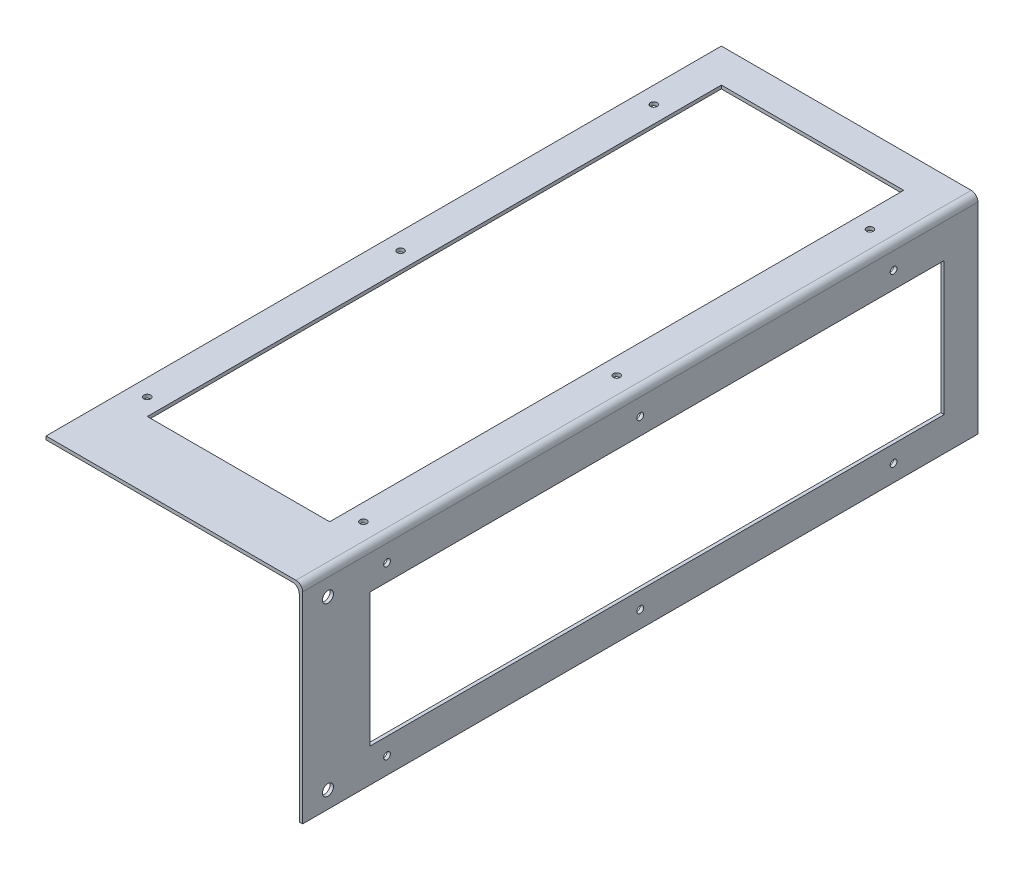
ISO-10303-21;
HEADER;
FILE_DESCRIPTION(('STEP AP214'),'2;1');
FILE_NAME('part.step','',(''),(''),'','','');
FILE_SCHEMA(('AUTOMOTIVE_DESIGN { 1 0 10303 214 1 1 1 1 }'));
ENDSEC;
DATA;
#1=APPLICATION_CONTEXT('core data for automotive mechanical design processes');
#2=APPLICATION_PROTOCOL_DEFINITION('international standard','automotive_design',2000,#1);
#3=PRODUCT_CONTEXT('',#1,'mechanical');
#4=PRODUCT('Part','Part','',(#3));
#5=PRODUCT_RELATED_PRODUCT_CATEGORY('part','',(#4));
#6=PRODUCT_DEFINITION_FORMATION('','',#4);
#7=PRODUCT_DEFINITION_CONTEXT('part definition',#1,'design');
#8=PRODUCT_DEFINITION('design','',#6,#7);
#9=PRODUCT_DEFINITION_SHAPE('','',#8);
#10=(LENGTH_UNIT() NAMED_UNIT(*) SI_UNIT(.MILLI.,.METRE.));
#11=(NAMED_UNIT(*) PLANE_ANGLE_UNIT() SI_UNIT($,.RADIAN.));
#12=(NAMED_UNIT(*) SI_UNIT($,.STERADIAN.) SOLID_ANGLE_UNIT());
#13=UNCERTAINTY_MEASURE_WITH_UNIT(LENGTH_MEASURE(1.E-05),#10,'distance_accuracy_value','');
#14=(GEOMETRIC_REPRESENTATION_CONTEXT(3) GLOBAL_UNCERTAINTY_ASSIGNED_CONTEXT((#13)) GLOBAL_UNIT_ASSIGNED_CONTEXT((#10,
#11,#12)) REPRESENTATION_CONTEXT('',''));
#15=CARTESIAN_POINT('',(0.,0.,0.));
#16=DIRECTION('',(0.,0.,1.));
#17=DIRECTION('',(1.,0.,0.));
#18=AXIS2_PLACEMENT_3D('',#15,#16,#17);
#19=CARTESIAN_POINT('',(148.,0.,400.));
#20=DIRECTION('',(0.,-1.,0.));
#21=DIRECTION('',(1.,0.,0.));
#22=AXIS2_PLACEMENT_3D('',#19,#20,#21);
#23=PLANE('',#22);
#24=CARTESIAN_POINT('',(10.,0.,200.));
#25=DIRECTION('',(0.,1.,0.));
#26=DIRECTION('',(-1.,0.,0.));
#27=AXIS2_PLACEMENT_3D('',#24,#25,#26);
#28=CIRCLE('',#27,2.);
#29=CARTESIAN_POINT('',(8.,0.,200.));
#30=VERTEX_POINT('',#29);
#31=EDGE_CURVE('E325',#30,#30,#28,.T.);
#32=ORIENTED_EDGE('',*,*,#31,.F.);
#33=EDGE_LOOP('',(#32));
#34=FACE_BOUND('',#33,.T.);
#35=CARTESIAN_POINT('',(10.,0.,350.));
#36=DIRECTION('',(0.,1.,0.));
#37=DIRECTION('',(-1.,0.,0.));
#38=AXIS2_PLACEMENT_3D('',#35,#36,#37);
#39=CIRCLE('',#38,2.);
#40=CARTESIAN_POINT('',(8.,0.,350.));
#41=VERTEX_POINT('',#40);
#42=EDGE_CURVE('E329',#41,#41,#39,.T.);
#43=ORIENTED_EDGE('',*,*,#42,.F.);
#44=EDGE_LOOP('',(#43));
#45=FACE_BOUND('',#44,.T.);
#46=CARTESIAN_POINT('',(138.,0.,50.));
#47=DIRECTION('',(0.,1.,0.));
#48=DIRECTION('',(-1.,0.,0.));
#49=AXIS2_PLACEMENT_3D('',#46,#47,#48);
#50=CIRCLE('',#49,2.);
#51=CARTESIAN_POINT('',(136.,0.,50.));
#52=VERTEX_POINT('',#51);
#53=EDGE_CURVE('E333',#52,#52,#50,.T.);
#54=ORIENTED_EDGE('',*,*,#53,.F.);
#55=EDGE_LOOP('',(#54));
#56=FACE_BOUND('',#55,.T.);
#57=CARTESIAN_POINT('',(138.,0.,200.));
#58=DIRECTION('',(0.,1.,0.));
#59=DIRECTION('',(-1.,0.,0.));
#60=AXIS2_PLACEMENT_3D('',#57,#58,#59);
#61=CIRCLE('',#60,2.);
#62=CARTESIAN_POINT('',(136.,0.,200.));
#63=VERTEX_POINT('',#62);
#64=EDGE_CURVE('E337',#63,#63,#61,.T.);
#65=ORIENTED_EDGE('',*,*,#64,.F.);
#66=EDGE_LOOP('',(#65));
#67=FACE_BOUND('',#66,.T.);
#68=CARTESIAN_POINT('',(138.,0.,350.));
#69=DIRECTION('',(0.,1.,0.));
#70=DIRECTION('',(-1.,0.,0.));
#71=AXIS2_PLACEMENT_3D('',#68,#69,#70);
#72=CIRCLE('',#71,2.);
#73=CARTESIAN_POINT('',(136.,0.,350.));
#74=VERTEX_POINT('',#73);
#75=EDGE_CURVE('E341',#74,#74,#72,.T.);
#76=ORIENTED_EDGE('',*,*,#75,.F.);
#77=EDGE_LOOP('',(#76));
#78=FACE_BOUND('',#77,.T.);
#79=CARTESIAN_POINT('',(10.,0.,50.));
#80=DIRECTION('',(0.,1.,0.));
#81=DIRECTION('',(-1.,0.,0.));
#82=AXIS2_PLACEMENT_3D('',#79,#80,#81);
#83=CIRCLE('',#82,2.);
#84=CARTESIAN_POINT('',(8.,0.,50.));
#85=VERTEX_POINT('',#84);
#86=EDGE_CURVE('E345',#85,#85,#83,.T.);
#87=ORIENTED_EDGE('',*,*,#86,.F.);
#88=EDGE_LOOP('',(#87));
#89=FACE_BOUND('',#88,.T.);
#90=DIRECTION('',(-1.,0.,0.));
#91=VECTOR('',#90,1.);
#92=CARTESIAN_POINT('',(20.,0.,20.));
#93=LINE('',#92,#91);
#94=CARTESIAN_POINT('',(128.,0.,20.));
#95=VERTEX_POINT('',#94);
#96=CARTESIAN_POINT('',(20.,0.,20.));
#97=VERTEX_POINT('',#96);
#98=EDGE_CURVE('E174',#95,#97,#93,.T.);
#99=ORIENTED_EDGE('',*,*,#98,.F.);
#100=DIRECTION('',(0.,0.,-1.));
#101=VECTOR('',#100,1.);
#102=CARTESIAN_POINT('',(128.,0.,360.));
#103=LINE('',#102,#101);
#104=CARTESIAN_POINT('',(128.,0.,360.));
#105=VERTEX_POINT('',#104);
#106=EDGE_CURVE('E46',#105,#95,#103,.T.);
#107=ORIENTED_EDGE('',*,*,#106,.F.);
#108=DIRECTION('',(1.,0.,0.));
#109=VECTOR('',#108,1.);
#110=CARTESIAN_POINT('',(20.,0.,360.));
#111=LINE('',#110,#109);
#112=CARTESIAN_POINT('',(20.,0.,360.));
#113=VERTEX_POINT('',#112);
#114=EDGE_CURVE('E162',#113,#105,#111,.T.);
#115=ORIENTED_EDGE('',*,*,#114,.F.);
#116=DIRECTION('',(0.,0.,1.));
#117=VECTOR('',#116,1.);
#118=CARTESIAN_POINT('',(20.,0.,360.));
#119=LINE('',#118,#117);
#120=EDGE_CURVE('E165',#97,#113,#119,.T.);
#121=ORIENTED_EDGE('',*,*,#120,.F.);
#122=EDGE_LOOP('',(#99,#107,#115,#121));
#123=FACE_BOUND('',#122,.T.);
#124=DIRECTION('',(-1.,0.,0.));
#125=VECTOR('',#124,1.);
#126=CARTESIAN_POINT('',(148.,0.,0.));
#127=LINE('',#126,#125);
#128=CARTESIAN_POINT('',(148.,0.,0.));
#129=VERTEX_POINT('',#128);
#130=CARTESIAN_POINT('',(0.,0.,0.));
#131=VERTEX_POINT('',#130);
#132=EDGE_CURVE('E210',#129,#131,#127,.T.);
#133=ORIENTED_EDGE('',*,*,#132,.T.);
#134=DIRECTION('',(0.,0.,-1.));
#135=VECTOR('',#134,1.);
#136=CARTESIAN_POINT('',(0.,0.,400.));
#137=LINE('',#136,#135);
#138=CARTESIAN_POINT('',(0.,0.,400.));
#139=VERTEX_POINT('',#138);
#140=EDGE_CURVE('E11',#139,#131,#137,.T.);
#141=ORIENTED_EDGE('',*,*,#140,.F.);
#142=DIRECTION('',(-1.,0.,0.));
#143=VECTOR('',#142,1.);
#144=CARTESIAN_POINT('',(148.,0.,400.));
#145=LINE('',#144,#143);
#146=CARTESIAN_POINT('',(148.,0.,400.));
#147=VERTEX_POINT('',#146);
#148=EDGE_CURVE('E217',#147,#139,#145,.T.);
#149=ORIENTED_EDGE('',*,*,#148,.F.);
#150=DIRECTION('',(0.,0.,-1.));
#151=VECTOR('',#150,1.);
#152=CARTESIAN_POINT('',(148.,0.,400.));
#153=LINE('',#152,#151);
#154=EDGE_CURVE('E235',#147,#129,#153,.T.);
#155=ORIENTED_EDGE('',*,*,#154,.T.);
#156=EDGE_LOOP('',(#133,#141,#149,#155));
#157=FACE_BOUND('',#156,.T.);
#158=ADVANCED_FACE('F32',(#34,#45,#56,#67,#78,#89,#123,#157),#23,.F.);
#159=CARTESIAN_POINT('',(0.,0.,400.));
#160=DIRECTION('',(1.,0.,0.));
#161=DIRECTION('',(0.,0.,-1.));
#162=AXIS2_PLACEMENT_3D('',#159,#160,#161);
#163=PLANE('',#162);
#164=DIRECTION('',(0.,-1.,0.));
#165=VECTOR('',#164,1.);
#166=CARTESIAN_POINT('',(0.,0.,0.));
#167=LINE('',#166,#165);
#168=CARTESIAN_POINT('',(0.,-2.,0.));
#169=VERTEX_POINT('',#168);
#170=EDGE_CURVE('E238',#131,#169,#167,.T.);
#171=ORIENTED_EDGE('',*,*,#170,.T.);
#172=DIRECTION('',(0.,0.,-1.));
#173=VECTOR('',#172,1.);
#174=CARTESIAN_POINT('',(0.,-2.,400.));
#175=LINE('',#174,#173);
#176=CARTESIAN_POINT('',(0.,-2.,400.));
#177=VERTEX_POINT('',#176);
#178=EDGE_CURVE('E39',#177,#169,#175,.T.);
#179=ORIENTED_EDGE('',*,*,#178,.F.);
#180=DIRECTION('',(0.,-1.,0.));
#181=VECTOR('',#180,1.);
#182=CARTESIAN_POINT('',(0.,0.,400.));
#183=LINE('',#182,#181);
#184=EDGE_CURVE('E220',#139,#177,#183,.T.);
#185=ORIENTED_EDGE('',*,*,#184,.F.);
#186=ORIENTED_EDGE('',*,*,#140,.T.);
#187=EDGE_LOOP('',(#171,#179,#185,#186));
#188=FACE_BOUND('',#187,.T.);
#189=ADVANCED_FACE('F293',(#188),#163,.F.);
#190=CARTESIAN_POINT('',(0.,-2.,400.));
#191=DIRECTION('',(0.,1.,0.));
#192=DIRECTION('',(0.,0.,1.));
#193=AXIS2_PLACEMENT_3D('',#190,#191,#192);
#194=PLANE('',#193);
#195=CARTESIAN_POINT('',(10.,-2.,200.));
#196=DIRECTION('',(0.,1.,0.));
#197=DIRECTION('',(-1.,0.,0.));
#198=AXIS2_PLACEMENT_3D('',#195,#196,#197);
#199=CIRCLE('',#198,2.);
#200=CARTESIAN_POINT('',(8.,-2.,200.));
#201=VERTEX_POINT('',#200);
#202=EDGE_CURVE('E625',#201,#201,#199,.T.);
#203=ORIENTED_EDGE('',*,*,#202,.T.);
#204=EDGE_LOOP('',(#203));
#205=FACE_BOUND('',#204,.T.);
#206=CARTESIAN_POINT('',(10.,-2.,350.));
#207=DIRECTION('',(0.,1.,0.));
#208=DIRECTION('',(-1.,0.,0.));
#209=AXIS2_PLACEMENT_3D('',#206,#207,#208);
#210=CIRCLE('',#209,2.);
#211=CARTESIAN_POINT('',(8.,-2.,350.));
#212=VERTEX_POINT('',#211);
#213=EDGE_CURVE('E629',#212,#212,#210,.T.);
#214=ORIENTED_EDGE('',*,*,#213,.T.);
#215=EDGE_LOOP('',(#214));
#216=FACE_BOUND('',#215,.T.);
#217=CARTESIAN_POINT('',(138.,-1.99999999999999,50.));
#218=DIRECTION('',(0.,1.,0.));
#219=DIRECTION('',(-1.,0.,0.));
#220=AXIS2_PLACEMENT_3D('',#217,#218,#219);
#221=CIRCLE('',#220,2.);
#222=CARTESIAN_POINT('',(136.,-1.99999999999999,50.));
#223=VERTEX_POINT('',#222);
#224=EDGE_CURVE('E633',#223,#223,#221,.T.);
#225=ORIENTED_EDGE('',*,*,#224,.T.);
#226=EDGE_LOOP('',(#225));
#227=FACE_BOUND('',#226,.T.);
#228=CARTESIAN_POINT('',(138.,-1.99999999999999,200.));
#229=DIRECTION('',(0.,1.,0.));
#230=DIRECTION('',(-1.,0.,0.));
#231=AXIS2_PLACEMENT_3D('',#228,#229,#230);
#232=CIRCLE('',#231,2.);
#233=CARTESIAN_POINT('',(136.,-1.99999999999999,200.));
#234=VERTEX_POINT('',#233);
#235=EDGE_CURVE('E637',#234,#234,#232,.T.);
#236=ORIENTED_EDGE('',*,*,#235,.T.);
#237=EDGE_LOOP('',(#236));
#238=FACE_BOUND('',#237,.T.);
#239=CARTESIAN_POINT('',(138.,-1.99999999999999,350.));
#240=DIRECTION('',(0.,1.,0.));
#241=DIRECTION('',(-1.,0.,0.));
#242=AXIS2_PLACEMENT_3D('',#239,#240,#241);
#243=CIRCLE('',#242,2.);
#244=CARTESIAN_POINT('',(136.,-1.99999999999999,350.));
#245=VERTEX_POINT('',#244);
#246=EDGE_CURVE('E621',#245,#245,#243,.T.);
#247=ORIENTED_EDGE('',*,*,#246,.T.);
#248=EDGE_LOOP('',(#247));
#249=FACE_BOUND('',#248,.T.);
#250=CARTESIAN_POINT('',(10.,-2.,50.));
#251=DIRECTION('',(0.,1.,0.));
#252=DIRECTION('',(-1.,0.,0.));
#253=AXIS2_PLACEMENT_3D('',#250,#251,#252);
#254=CIRCLE('',#253,2.);
#255=CARTESIAN_POINT('',(8.,-2.,50.));
#256=VERTEX_POINT('',#255);
#257=EDGE_CURVE('E641',#256,#256,#254,.T.);
#258=ORIENTED_EDGE('',*,*,#257,.T.);
#259=EDGE_LOOP('',(#258));
#260=FACE_BOUND('',#259,.T.);
#261=DIRECTION('',(1.,0.,0.));
#262=VECTOR('',#261,1.);
#263=CARTESIAN_POINT('',(20.,-2.,360.));
#264=LINE('',#263,#262);
#265=CARTESIAN_POINT('',(20.,-2.,360.));
#266=VERTEX_POINT('',#265);
#267=CARTESIAN_POINT('',(128.,-1.99999999999999,360.));
#268=VERTEX_POINT('',#267);
#269=EDGE_CURVE('E152',#266,#268,#264,.T.);
#270=ORIENTED_EDGE('',*,*,#269,.T.);
#271=DIRECTION('',(0.,0.,-1.));
#272=VECTOR('',#271,1.);
#273=CARTESIAN_POINT('',(128.,-1.99999999999999,360.));
#274=LINE('',#273,#272);
#275=CARTESIAN_POINT('',(128.,-1.99999999999999,20.));
#276=VERTEX_POINT('',#275);
#277=EDGE_CURVE('E146',#268,#276,#274,.T.);
#278=ORIENTED_EDGE('',*,*,#277,.T.);
#279=DIRECTION('',(-1.,0.,0.));
#280=VECTOR('',#279,1.);
#281=CARTESIAN_POINT('',(20.,-2.,20.));
#282=LINE('',#281,#280);
#283=CARTESIAN_POINT('',(20.,-2.,20.));
#284=VERTEX_POINT('',#283);
#285=EDGE_CURVE('E155',#276,#284,#282,.T.);
#286=ORIENTED_EDGE('',*,*,#285,.T.);
#287=DIRECTION('',(0.,0.,1.));
#288=VECTOR('',#287,1.);
#289=CARTESIAN_POINT('',(20.,-2.,360.));
#290=LINE('',#289,#288);
#291=EDGE_CURVE('E54',#284,#266,#290,.T.);
#292=ORIENTED_EDGE('',*,*,#291,.T.);
#293=EDGE_LOOP('',(#270,#278,#286,#292));
#294=FACE_BOUND('',#293,.T.);
#295=DIRECTION('',(1.,0.,0.));
#296=VECTOR('',#295,1.);
#297=CARTESIAN_POINT('',(0.,-2.,0.));
#298=LINE('',#297,#296);
#299=CARTESIAN_POINT('',(146.,-2.,0.));
#300=VERTEX_POINT('',#299);
#301=EDGE_CURVE('E240',#169,#300,#298,.T.);
#302=ORIENTED_EDGE('',*,*,#301,.T.);
#303=DIRECTION('',(0.,0.,-1.));
#304=VECTOR('',#303,1.);
#305=CARTESIAN_POINT('',(146.,-2.,400.));
#306=LINE('',#305,#304);
#307=CARTESIAN_POINT('',(146.,-2.,400.));
#308=VERTEX_POINT('',#307);
#309=EDGE_CURVE('E265',#308,#300,#306,.T.);
#310=ORIENTED_EDGE('',*,*,#309,.F.);
#311=DIRECTION('',(1.,0.,0.));
#312=VECTOR('',#311,1.);
#313=CARTESIAN_POINT('',(0.,-2.,400.));
#314=LINE('',#313,#312);
#315=EDGE_CURVE('E223',#177,#308,#314,.T.);
#316=ORIENTED_EDGE('',*,*,#315,.F.);
#317=ORIENTED_EDGE('',*,*,#178,.T.);
#318=EDGE_LOOP('',(#302,#310,#316,#317));
#319=FACE_BOUND('',#318,.T.);
#320=ADVANCED_FACE('F159',(#205,#216,#227,#238,#249,#260,#294,#319),#194,.F.);
#321=CARTESIAN_POINT('',(146.,-6.,400.));
#322=DIRECTION('',(0.,0.,-1.));
#323=DIRECTION('',(-1.,0.,0.));
#324=AXIS2_PLACEMENT_3D('',#321,#322,#323);
#325=CYLINDRICAL_SURFACE('',#324,4.);
#326=CARTESIAN_POINT('',(146.,-6.,0.));
#327=DIRECTION('',(0.,0.,-1.));
#328=DIRECTION('',(1.,0.,0.));
#329=AXIS2_PLACEMENT_3D('',#326,#327,#328);
#330=CIRCLE('',#329,4.);
#331=CARTESIAN_POINT('',(150.,-6.00000000000003,0.));
#332=VERTEX_POINT('',#331);
#333=EDGE_CURVE('E242',#300,#332,#330,.T.);
#334=ORIENTED_EDGE('',*,*,#333,.T.);
#335=DIRECTION('',(0.,0.,-1.));
#336=VECTOR('',#335,1.);
#337=CARTESIAN_POINT('',(150.,-6.00000000000003,400.));
#338=LINE('',#337,#336);
#339=CARTESIAN_POINT('',(150.,-6.00000000000003,400.));
#340=VERTEX_POINT('',#339);
#341=EDGE_CURVE('E262',#340,#332,#338,.T.);
#342=ORIENTED_EDGE('',*,*,#341,.F.);
#343=CARTESIAN_POINT('',(146.,-6.,400.));
#344=DIRECTION('',(0.,0.,-1.));
#345=DIRECTION('',(1.,0.,0.));
#346=AXIS2_PLACEMENT_3D('',#343,#344,#345);
#347=CIRCLE('',#346,4.);
#348=EDGE_CURVE('E225',#308,#340,#347,.T.);
#349=ORIENTED_EDGE('',*,*,#348,.F.);
#350=ORIENTED_EDGE('',*,*,#309,.T.);
#351=EDGE_LOOP('',(#334,#342,#349,#350));
#352=FACE_BOUND('',#351,.T.);
#353=ADVANCED_FACE('F281',(#352),#325,.F.);
#354=CARTESIAN_POINT('',(150.,-6.00000000000003,400.));
#355=DIRECTION('',(1.,0.,0.));
#356=DIRECTION('',(0.,1.,0.));
#357=AXIS2_PLACEMENT_3D('',#354,#355,#356);
#358=PLANE('',#357);
#359=CARTESIAN_POINT('',(150.,-14.0000000000001,50.));
#360=DIRECTION('',(1.,0.,0.));
#361=DIRECTION('',(0.,0.,1.));
#362=AXIS2_PLACEMENT_3D('',#359,#360,#361);
#363=CIRCLE('',#362,2.);
#364=CARTESIAN_POINT('',(150.,-14.0000000000001,52.));
#365=VERTEX_POINT('',#364);
#366=EDGE_CURVE('E605',#365,#365,#363,.T.);
#367=ORIENTED_EDGE('',*,*,#366,.T.);
#368=EDGE_LOOP('',(#367));
#369=FACE_BOUND('',#368,.T.);
#370=CARTESIAN_POINT('',(150.,-13.999999999999,200.));
#371=DIRECTION('',(1.,0.,0.));
#372=DIRECTION('',(0.,0.,1.));
#373=AXIS2_PLACEMENT_3D('',#370,#371,#372);
#374=CIRCLE('',#373,2.00000000000002);
#375=CARTESIAN_POINT('',(150.,-13.999999999999,202.));
#376=VERTEX_POINT('',#375);
#377=EDGE_CURVE('E711',#376,#376,#374,.T.);
#378=ORIENTED_EDGE('',*,*,#377,.T.);
#379=EDGE_LOOP('',(#378));
#380=FACE_BOUND('',#379,.T.);
#381=CARTESIAN_POINT('',(150.,-13.9999999999979,350.));
#382=DIRECTION('',(1.,0.,0.));
#383=DIRECTION('',(0.,0.,1.));
#384=AXIS2_PLACEMENT_3D('',#381,#382,#383);
#385=CIRCLE('',#384,2.);
#386=CARTESIAN_POINT('',(150.,-13.9999999999979,352.));
#387=VERTEX_POINT('',#386);
#388=EDGE_CURVE('E705',#387,#387,#385,.T.);
#389=ORIENTED_EDGE('',*,*,#388,.T.);
#390=EDGE_LOOP('',(#389));
#391=FACE_BOUND('',#390,.T.);
#392=CARTESIAN_POINT('',(150.,-113.000000000002,350.));
#393=DIRECTION('',(1.,0.,0.));
#394=DIRECTION('',(0.,0.,-1.));
#395=AXIS2_PLACEMENT_3D('',#392,#393,#394);
#396=CIRCLE('',#395,2.);
#397=CARTESIAN_POINT('',(150.,-113.000000000002,348.));
#398=VERTEX_POINT('',#397);
#399=EDGE_CURVE('E697',#398,#398,#396,.T.);
#400=ORIENTED_EDGE('',*,*,#399,.T.);
#401=EDGE_LOOP('',(#400));
#402=FACE_BOUND('',#401,.T.);
#403=CARTESIAN_POINT('',(150.,-113.000000000001,200.));
#404=DIRECTION('',(1.,0.,0.));
#405=DIRECTION('',(0.,0.,-1.));
#406=AXIS2_PLACEMENT_3D('',#403,#404,#405);
#407=CIRCLE('',#406,2.00000000000002);
#408=CARTESIAN_POINT('',(150.,-113.000000000001,198.));
#409=VERTEX_POINT('',#408);
#410=EDGE_CURVE('E620',#409,#409,#407,.T.);
#411=ORIENTED_EDGE('',*,*,#410,.T.);
#412=EDGE_LOOP('',(#411));
#413=FACE_BOUND('',#412,.T.);
#414=CARTESIAN_POINT('',(150.,-113.,50.));
#415=DIRECTION('',(1.,0.,0.));
#416=DIRECTION('',(0.,0.,-1.));
#417=AXIS2_PLACEMENT_3D('',#414,#415,#416);
#418=CIRCLE('',#417,2.);
#419=CARTESIAN_POINT('',(150.,-113.,48.));
#420=VERTEX_POINT('',#419);
#421=EDGE_CURVE('E614',#420,#420,#418,.T.);
#422=ORIENTED_EDGE('',*,*,#421,.T.);
#423=EDGE_LOOP('',(#422));
#424=FACE_BOUND('',#423,.T.);
#425=CARTESIAN_POINT('',(150.,-14.,385.));
#426=DIRECTION('',(1.,0.,0.));
#427=DIRECTION('',(0.,0.,-1.));
#428=AXIS2_PLACEMENT_3D('',#425,#426,#427);
#429=CIRCLE('',#428,3.24999999999995);
#430=CARTESIAN_POINT('',(150.,-14.,381.75));
#431=VERTEX_POINT('',#430);
#432=EDGE_CURVE('E175',#431,#431,#429,.T.);
#433=ORIENTED_EDGE('',*,*,#432,.T.);
#434=EDGE_LOOP('',(#433));
#435=FACE_BOUND('',#434,.T.);
#436=CARTESIAN_POINT('',(150.,-113.,385.));
#437=DIRECTION('',(1.,0.,0.));
#438=DIRECTION('',(0.,0.,-1.));
#439=AXIS2_PLACEMENT_3D('',#436,#437,#438);
#440=CIRCLE('',#439,3.24999999999995);
#441=CARTESIAN_POINT('',(150.,-113.,381.75));
#442=VERTEX_POINT('',#441);
#443=EDGE_CURVE('E649',#442,#442,#440,.T.);
#444=ORIENTED_EDGE('',*,*,#443,.T.);
#445=EDGE_LOOP('',(#444));
#446=FACE_BOUND('',#445,.T.);
#447=DIRECTION('',(0.,0.,-1.));
#448=VECTOR('',#447,1.);
#449=CARTESIAN_POINT('',(150.,-103.,360.));
#450=LINE('',#449,#448);
#451=CARTESIAN_POINT('',(150.,-103.,360.));
#452=VERTEX_POINT('',#451);
#453=CARTESIAN_POINT('',(150.,-103.,20.));
#454=VERTEX_POINT('',#453);
#455=EDGE_CURVE('E195',#452,#454,#450,.T.);
#456=ORIENTED_EDGE('',*,*,#455,.T.);
#457=DIRECTION('',(0.,1.,0.));
#458=VECTOR('',#457,1.);
#459=CARTESIAN_POINT('',(150.,-24.,20.));
#460=LINE('',#459,#458);
#461=CARTESIAN_POINT('',(150.,-24.,20.));
#462=VERTEX_POINT('',#461);
#463=EDGE_CURVE('E185',#454,#462,#460,.T.);
#464=ORIENTED_EDGE('',*,*,#463,.T.);
#465=DIRECTION('',(0.,0.,1.));
#466=VECTOR('',#465,1.);
#467=CARTESIAN_POINT('',(150.,-24.,360.));
#468=LINE('',#467,#466);
#469=CARTESIAN_POINT('',(150.,-24.,360.));
#470=VERTEX_POINT('',#469);
#471=EDGE_CURVE('E188',#462,#470,#468,.T.);
#472=ORIENTED_EDGE('',*,*,#471,.T.);
#473=DIRECTION('',(0.,-1.,0.));
#474=VECTOR('',#473,1.);
#475=CARTESIAN_POINT('',(150.,-24.,360.));
#476=LINE('',#475,#474);
#477=EDGE_CURVE('E192',#470,#452,#476,.T.);
#478=ORIENTED_EDGE('',*,*,#477,.T.);
#479=EDGE_LOOP('',(#456,#464,#472,#478));
#480=FACE_BOUND('',#479,.T.);
#481=DIRECTION('',(0.,-1.,0.));
#482=VECTOR('',#481,1.);
#483=CARTESIAN_POINT('',(150.,-6.00000000000003,0.));
#484=LINE('',#483,#482);
#485=CARTESIAN_POINT('',(150.,-123.,0.));
#486=VERTEX_POINT('',#485);
#487=EDGE_CURVE('E244',#332,#486,#484,.T.);
#488=ORIENTED_EDGE('',*,*,#487,.T.);
#489=DIRECTION('',(0.,0.,-1.));
#490=VECTOR('',#489,1.);
#491=CARTESIAN_POINT('',(150.,-123.,400.));
#492=LINE('',#491,#490);
#493=CARTESIAN_POINT('',(150.,-123.,400.));
#494=VERTEX_POINT('',#493);
#495=EDGE_CURVE('E259',#494,#486,#492,.T.);
#496=ORIENTED_EDGE('',*,*,#495,.F.);
#497=DIRECTION('',(0.,-1.,0.));
#498=VECTOR('',#497,1.);
#499=CARTESIAN_POINT('',(150.,-6.00000000000003,400.));
#500=LINE('',#499,#498);
#501=EDGE_CURVE('E227',#340,#494,#500,.T.);
#502=ORIENTED_EDGE('',*,*,#501,.F.);
#503=ORIENTED_EDGE('',*,*,#341,.T.);
#504=EDGE_LOOP('',(#488,#496,#502,#503));
#505=FACE_BOUND('',#504,.T.);
#506=ADVANCED_FACE('F285',(#369,#380,#391,#402,#413,#424,#435,#446,#480,#505),#358,.F.);
#507=CARTESIAN_POINT('',(150.,-123.,400.));
#508=DIRECTION('',(0.,1.,0.));
#509=DIRECTION('',(0.,0.,1.));
#510=AXIS2_PLACEMENT_3D('',#507,#508,#509);
#511=PLANE('',#510);
#512=DIRECTION('',(1.,0.,0.));
#513=VECTOR('',#512,1.);
#514=CARTESIAN_POINT('',(150.,-123.,0.));
#515=LINE('',#514,#513);
#516=CARTESIAN_POINT('',(152.,-123.,0.));
#517=VERTEX_POINT('',#516);
#518=EDGE_CURVE('E246',#486,#517,#515,.T.);
#519=ORIENTED_EDGE('',*,*,#518,.T.);
#520=DIRECTION('',(0.,0.,-1.));
#521=VECTOR('',#520,1.);
#522=CARTESIAN_POINT('',(152.,-123.,400.));
#523=LINE('',#522,#521);
#524=CARTESIAN_POINT('',(152.,-123.,400.));
#525=VERTEX_POINT('',#524);
#526=EDGE_CURVE('E256',#525,#517,#523,.T.);
#527=ORIENTED_EDGE('',*,*,#526,.F.);
#528=DIRECTION('',(1.,0.,0.));
#529=VECTOR('',#528,1.);
#530=CARTESIAN_POINT('',(150.,-123.,400.));
#531=LINE('',#530,#529);
#532=EDGE_CURVE('E229',#494,#525,#531,.T.);
#533=ORIENTED_EDGE('',*,*,#532,.F.);
#534=ORIENTED_EDGE('',*,*,#495,.T.);
#535=EDGE_LOOP('',(#519,#527,#533,#534));
#536=FACE_BOUND('',#535,.T.);
#537=ADVANCED_FACE('F306',(#536),#511,.F.);
#538=CARTESIAN_POINT('',(152.,-123.,400.));
#539=DIRECTION('',(-1.,0.,0.));
#540=DIRECTION('',(0.,0.,1.));
#541=AXIS2_PLACEMENT_3D('',#538,#539,#540);
#542=PLANE('',#541);
#543=CARTESIAN_POINT('',(152.,-14.0000000000001,50.));
#544=DIRECTION('',(1.,0.,0.));
#545=DIRECTION('',(0.,0.,1.));
#546=AXIS2_PLACEMENT_3D('',#543,#544,#545);
#547=CIRCLE('',#546,2.);
#548=CARTESIAN_POINT('',(152.,-14.0000000000001,52.));
#549=VERTEX_POINT('',#548);
#550=EDGE_CURVE('E608',#549,#549,#547,.T.);
#551=ORIENTED_EDGE('',*,*,#550,.F.);
#552=EDGE_LOOP('',(#551));
#553=FACE_BOUND('',#552,.T.);
#554=CARTESIAN_POINT('',(152.,-13.999999999999,200.));
#555=DIRECTION('',(1.,0.,0.));
#556=DIRECTION('',(0.,0.,1.));
#557=AXIS2_PLACEMENT_3D('',#554,#555,#556);
#558=CIRCLE('',#557,2.00000000000002);
#559=CARTESIAN_POINT('',(152.,-13.999999999999,202.));
#560=VERTEX_POINT('',#559);
#561=EDGE_CURVE('E610',#560,#560,#558,.T.);
#562=ORIENTED_EDGE('',*,*,#561,.F.);
#563=EDGE_LOOP('',(#562));
#564=FACE_BOUND('',#563,.T.);
#565=CARTESIAN_POINT('',(152.,-13.9999999999979,350.));
#566=DIRECTION('',(1.,0.,0.));
#567=DIRECTION('',(0.,0.,1.));
#568=AXIS2_PLACEMENT_3D('',#565,#566,#567);
#569=CIRCLE('',#568,2.);
#570=CARTESIAN_POINT('',(152.,-13.9999999999979,352.));
#571=VERTEX_POINT('',#570);
#572=EDGE_CURVE('E708',#571,#571,#569,.T.);
#573=ORIENTED_EDGE('',*,*,#572,.F.);
#574=EDGE_LOOP('',(#573));
#575=FACE_BOUND('',#574,.T.);
#576=CARTESIAN_POINT('',(152.,-113.000000000002,350.));
#577=DIRECTION('',(1.,0.,0.));
#578=DIRECTION('',(0.,0.,-1.));
#579=AXIS2_PLACEMENT_3D('',#576,#577,#578);
#580=CIRCLE('',#579,2.);
#581=CARTESIAN_POINT('',(152.,-113.000000000002,348.));
#582=VERTEX_POINT('',#581);
#583=EDGE_CURVE('E702',#582,#582,#580,.T.);
#584=ORIENTED_EDGE('',*,*,#583,.F.);
#585=EDGE_LOOP('',(#584));
#586=FACE_BOUND('',#585,.T.);
#587=CARTESIAN_POINT('',(152.,-113.000000000001,200.));
#588=DIRECTION('',(1.,0.,0.));
#589=DIRECTION('',(0.,0.,-1.));
#590=AXIS2_PLACEMENT_3D('',#587,#588,#589);
#591=CIRCLE('',#590,2.00000000000002);
#592=CARTESIAN_POINT('',(152.,-113.000000000001,198.));
#593=VERTEX_POINT('',#592);
#594=EDGE_CURVE('E692',#593,#593,#591,.T.);
#595=ORIENTED_EDGE('',*,*,#594,.F.);
#596=EDGE_LOOP('',(#595));
#597=FACE_BOUND('',#596,.T.);
#598=CARTESIAN_POINT('',(152.,-113.,50.));
#599=DIRECTION('',(1.,0.,0.));
#600=DIRECTION('',(0.,0.,-1.));
#601=AXIS2_PLACEMENT_3D('',#598,#599,#600);
#602=CIRCLE('',#601,2.);
#603=CARTESIAN_POINT('',(152.,-113.,48.));
#604=VERTEX_POINT('',#603);
#605=EDGE_CURVE('E617',#604,#604,#602,.T.);
#606=ORIENTED_EDGE('',*,*,#605,.F.);
#607=EDGE_LOOP('',(#606));
#608=FACE_BOUND('',#607,.T.);
#609=CARTESIAN_POINT('',(152.,-14.,385.));
#610=DIRECTION('',(1.,0.,0.));
#611=DIRECTION('',(0.,0.,-1.));
#612=AXIS2_PLACEMENT_3D('',#609,#610,#611);
#613=CIRCLE('',#612,3.24999999999995);
#614=CARTESIAN_POINT('',(152.,-14.,381.75));
#615=VERTEX_POINT('',#614);
#616=EDGE_CURVE('E647',#615,#615,#613,.T.);
#617=ORIENTED_EDGE('',*,*,#616,.F.);
#618=EDGE_LOOP('',(#617));
#619=FACE_BOUND('',#618,.T.);
#620=CARTESIAN_POINT('',(152.,-113.,385.));
#621=DIRECTION('',(1.,0.,0.));
#622=DIRECTION('',(0.,0.,-1.));
#623=AXIS2_PLACEMENT_3D('',#620,#621,#622);
#624=CIRCLE('',#623,3.24999999999995);
#625=CARTESIAN_POINT('',(152.,-113.,381.75));
#626=VERTEX_POINT('',#625);
#627=EDGE_CURVE('E168',#626,#626,#624,.T.);
#628=ORIENTED_EDGE('',*,*,#627,.F.);
#629=EDGE_LOOP('',(#628));
#630=FACE_BOUND('',#629,.T.);
#631=DIRECTION('',(0.,0.,1.));
#632=VECTOR('',#631,1.);
#633=CARTESIAN_POINT('',(152.,-24.,360.));
#634=LINE('',#633,#632);
#635=CARTESIAN_POINT('',(152.,-24.,20.));
#636=VERTEX_POINT('',#635);
#637=CARTESIAN_POINT('',(152.,-24.,360.));
#638=VERTEX_POINT('',#637);
#639=EDGE_CURVE('E200',#636,#638,#634,.T.);
#640=ORIENTED_EDGE('',*,*,#639,.F.);
#641=DIRECTION('',(0.,1.,0.));
#642=VECTOR('',#641,1.);
#643=CARTESIAN_POINT('',(152.,-24.,20.));
#644=LINE('',#643,#642);
#645=CARTESIAN_POINT('',(152.,-103.,20.));
#646=VERTEX_POINT('',#645);
#647=EDGE_CURVE('E181',#646,#636,#644,.T.);
#648=ORIENTED_EDGE('',*,*,#647,.F.);
#649=DIRECTION('',(0.,0.,-1.));
#650=VECTOR('',#649,1.);
#651=CARTESIAN_POINT('',(152.,-103.,360.));
#652=LINE('',#651,#650);
#653=CARTESIAN_POINT('',(152.,-103.,360.));
#654=VERTEX_POINT('',#653);
#655=EDGE_CURVE('E189',#654,#646,#652,.T.);
#656=ORIENTED_EDGE('',*,*,#655,.F.);
#657=DIRECTION('',(0.,-1.,0.));
#658=VECTOR('',#657,1.);
#659=CARTESIAN_POINT('',(152.,-24.,360.));
#660=LINE('',#659,#658);
#661=EDGE_CURVE('E203',#638,#654,#660,.T.);
#662=ORIENTED_EDGE('',*,*,#661,.F.);
#663=EDGE_LOOP('',(#640,#648,#656,#662));
#664=FACE_BOUND('',#663,.T.);
#665=DIRECTION('',(0.,1.,0.));
#666=VECTOR('',#665,1.);
#667=CARTESIAN_POINT('',(152.,-123.,0.));
#668=LINE('',#667,#666);
#669=CARTESIAN_POINT('',(152.,-4.00000000000001,0.));
#670=VERTEX_POINT('',#669);
#671=EDGE_CURVE('E248',#517,#670,#668,.T.);
#672=ORIENTED_EDGE('',*,*,#671,.T.);
#673=DIRECTION('',(0.,0.,-1.));
#674=VECTOR('',#673,1.);
#675=CARTESIAN_POINT('',(152.,-4.00000000000001,400.));
#676=LINE('',#675,#674);
#677=CARTESIAN_POINT('',(152.,-4.00000000000001,400.));
#678=VERTEX_POINT('',#677);
#679=EDGE_CURVE('E253',#678,#670,#676,.T.);
#680=ORIENTED_EDGE('',*,*,#679,.F.);
#681=DIRECTION('',(0.,1.,0.));
#682=VECTOR('',#681,1.);
#683=CARTESIAN_POINT('',(152.,-123.,400.));
#684=LINE('',#683,#682);
#685=EDGE_CURVE('E231',#525,#678,#684,.T.);
#686=ORIENTED_EDGE('',*,*,#685,.F.);
#687=ORIENTED_EDGE('',*,*,#526,.T.);
#688=EDGE_LOOP('',(#672,#680,#686,#687));
#689=FACE_BOUND('',#688,.T.);
#690=ADVANCED_FACE('F304',(#553,#564,#575,#586,#597,#608,#619,#630,#664,#689),#542,.F.);
#691=CARTESIAN_POINT('',(148.,-3.99999999999998,400.));
#692=DIRECTION('',(0.,0.,-1.));
#693=DIRECTION('',(-1.,0.,0.));
#694=AXIS2_PLACEMENT_3D('',#691,#692,#693);
#695=CYLINDRICAL_SURFACE('',#694,4.);
#696=CARTESIAN_POINT('',(148.,-3.99999999999998,0.));
#697=DIRECTION('',(0.,0.,1.));
#698=DIRECTION('',(1.,0.,0.));
#699=AXIS2_PLACEMENT_3D('',#696,#697,#698);
#700=CIRCLE('',#699,4.);
#701=EDGE_CURVE('E221',#670,#129,#700,.T.);
#702=ORIENTED_EDGE('',*,*,#701,.T.);
#703=ORIENTED_EDGE('',*,*,#154,.F.);
#704=CARTESIAN_POINT('',(148.,-3.99999999999998,400.));
#705=DIRECTION('',(0.,0.,1.));
#706=DIRECTION('',(1.,0.,0.));
#707=AXIS2_PLACEMENT_3D('',#704,#705,#706);
#708=CIRCLE('',#707,4.);
#709=EDGE_CURVE('E233',#678,#147,#708,.T.);
#710=ORIENTED_EDGE('',*,*,#709,.F.);
#711=ORIENTED_EDGE('',*,*,#679,.T.);
#712=EDGE_LOOP('',(#702,#703,#710,#711));
#713=FACE_BOUND('',#712,.T.);
#714=ADVANCED_FACE('F299',(#713),#695,.T.);
#715=CARTESIAN_POINT('',(146.,-6.,400.));
#716=DIRECTION('',(0.,0.,1.));
#717=DIRECTION('',(1.,0.,0.));
#718=AXIS2_PLACEMENT_3D('',#715,#716,#717);
#719=PLANE('',#718);
#720=ORIENTED_EDGE('',*,*,#148,.T.);
#721=ORIENTED_EDGE('',*,*,#184,.T.);
#722=ORIENTED_EDGE('',*,*,#315,.T.);
#723=ORIENTED_EDGE('',*,*,#348,.T.);
#724=ORIENTED_EDGE('',*,*,#501,.T.);
#725=ORIENTED_EDGE('',*,*,#532,.T.);
#726=ORIENTED_EDGE('',*,*,#685,.T.);
#727=ORIENTED_EDGE('',*,*,#709,.T.);
#728=EDGE_LOOP('',(#720,#721,#722,#723,#724,#725,#726,#727));
#729=FACE_BOUND('',#728,.T.);
#730=ADVANCED_FACE('F289',(#729),#719,.T.);
#731=CARTESIAN_POINT('',(146.,-6.,0.));
#732=DIRECTION('',(0.,0.,1.));
#733=DIRECTION('',(1.,0.,0.));
#734=AXIS2_PLACEMENT_3D('',#731,#732,#733);
#735=PLANE('',#734);
#736=ORIENTED_EDGE('',*,*,#132,.F.);
#737=ORIENTED_EDGE('',*,*,#701,.F.);
#738=ORIENTED_EDGE('',*,*,#671,.F.);
#739=ORIENTED_EDGE('',*,*,#518,.F.);
#740=ORIENTED_EDGE('',*,*,#487,.F.);
#741=ORIENTED_EDGE('',*,*,#333,.F.);
#742=ORIENTED_EDGE('',*,*,#301,.F.);
#743=ORIENTED_EDGE('',*,*,#170,.F.);
#744=EDGE_LOOP('',(#736,#737,#738,#739,#740,#741,#742,#743));
#745=FACE_BOUND('',#744,.T.);
#746=ADVANCED_FACE('F276',(#745),#735,.F.);
#747=CARTESIAN_POINT('',(150.,-24.,20.));
#748=DIRECTION('',(0.,0.,-1.));
#749=DIRECTION('',(-1.,0.,0.));
#750=AXIS2_PLACEMENT_3D('',#747,#748,#749);
#751=PLANE('',#750);
#752=ORIENTED_EDGE('',*,*,#647,.T.);
#753=DIRECTION('',(1.,0.,0.));
#754=VECTOR('',#753,1.);
#755=CARTESIAN_POINT('',(150.,-24.,20.));
#756=LINE('',#755,#754);
#757=EDGE_CURVE('E198',#462,#636,#756,.T.);
#758=ORIENTED_EDGE('',*,*,#757,.F.);
#759=ORIENTED_EDGE('',*,*,#463,.F.);
#760=DIRECTION('',(1.,0.,0.));
#761=VECTOR('',#760,1.);
#762=CARTESIAN_POINT('',(150.,-103.,20.));
#763=LINE('',#762,#761);
#764=EDGE_CURVE('E208',#454,#646,#763,.T.);
#765=ORIENTED_EDGE('',*,*,#764,.T.);
#766=EDGE_LOOP('',(#752,#758,#759,#765));
#767=FACE_BOUND('',#766,.T.);
#768=ADVANCED_FACE('F370',(#767),#751,.F.);
#769=CARTESIAN_POINT('',(150.,-103.,360.));
#770=DIRECTION('',(0.,-1.,0.));
#771=DIRECTION('',(0.,0.,-1.));
#772=AXIS2_PLACEMENT_3D('',#769,#770,#771);
#773=PLANE('',#772);
#774=ORIENTED_EDGE('',*,*,#655,.T.);
#775=ORIENTED_EDGE('',*,*,#764,.F.);
#776=ORIENTED_EDGE('',*,*,#455,.F.);
#777=DIRECTION('',(1.,0.,0.));
#778=VECTOR('',#777,1.);
#779=CARTESIAN_POINT('',(150.,-103.,360.));
#780=LINE('',#779,#778);
#781=EDGE_CURVE('E211',#452,#654,#780,.T.);
#782=ORIENTED_EDGE('',*,*,#781,.T.);
#783=EDGE_LOOP('',(#774,#775,#776,#782));
#784=FACE_BOUND('',#783,.T.);
#785=ADVANCED_FACE('F366',(#784),#773,.F.);
#786=CARTESIAN_POINT('',(150.,-24.,360.));
#787=DIRECTION('',(0.,0.,1.));
#788=DIRECTION('',(1.,0.,0.));
#789=AXIS2_PLACEMENT_3D('',#786,#787,#788);
#790=PLANE('',#789);
#791=ORIENTED_EDGE('',*,*,#661,.T.);
#792=ORIENTED_EDGE('',*,*,#781,.F.);
#793=ORIENTED_EDGE('',*,*,#477,.F.);
#794=DIRECTION('',(1.,0.,0.));
#795=VECTOR('',#794,1.);
#796=CARTESIAN_POINT('',(150.,-24.,360.));
#797=LINE('',#796,#795);
#798=EDGE_CURVE('E213',#470,#638,#797,.T.);
#799=ORIENTED_EDGE('',*,*,#798,.T.);
#800=EDGE_LOOP('',(#791,#792,#793,#799));
#801=FACE_BOUND('',#800,.T.);
#802=ADVANCED_FACE('F369',(#801),#790,.F.);
#803=CARTESIAN_POINT('',(150.,-24.,360.));
#804=DIRECTION('',(0.,1.,0.));
#805=DIRECTION('',(0.,0.,1.));
#806=AXIS2_PLACEMENT_3D('',#803,#804,#805);
#807=PLANE('',#806);
#808=ORIENTED_EDGE('',*,*,#639,.T.);
#809=ORIENTED_EDGE('',*,*,#798,.F.);
#810=ORIENTED_EDGE('',*,*,#471,.F.);
#811=ORIENTED_EDGE('',*,*,#757,.T.);
#812=EDGE_LOOP('',(#808,#809,#810,#811));
#813=FACE_BOUND('',#812,.T.);
#814=ADVANCED_FACE('F358',(#813),#807,.F.);
#815=CARTESIAN_POINT('',(128.,-1.99999999999999,360.));
#816=DIRECTION('',(1.,0.,0.));
#817=DIRECTION('',(0.,1.,0.));
#818=AXIS2_PLACEMENT_3D('',#815,#816,#817);
#819=PLANE('',#818);
#820=ORIENTED_EDGE('',*,*,#106,.T.);
#821=DIRECTION('',(0.,1.,0.));
#822=VECTOR('',#821,1.);
#823=CARTESIAN_POINT('',(128.,-1.99999999999999,20.));
#824=LINE('',#823,#822);
#825=EDGE_CURVE('E142',#276,#95,#824,.T.);
#826=ORIENTED_EDGE('',*,*,#825,.F.);
#827=ORIENTED_EDGE('',*,*,#277,.F.);
#828=DIRECTION('',(0.,1.,0.));
#829=VECTOR('',#828,1.);
#830=CARTESIAN_POINT('',(128.,-1.99999999999999,360.));
#831=LINE('',#830,#829);
#832=EDGE_CURVE('E179',#268,#105,#831,.T.);
#833=ORIENTED_EDGE('',*,*,#832,.T.);
#834=EDGE_LOOP('',(#820,#826,#827,#833));
#835=FACE_BOUND('',#834,.T.);
#836=ADVANCED_FACE('F144',(#835),#819,.F.);
#837=CARTESIAN_POINT('',(20.,-2.,360.));
#838=DIRECTION('',(0.,0.,1.));
#839=DIRECTION('',(1.,0.,0.));
#840=AXIS2_PLACEMENT_3D('',#837,#838,#839);
#841=PLANE('',#840);
#842=ORIENTED_EDGE('',*,*,#114,.T.);
#843=ORIENTED_EDGE('',*,*,#832,.F.);
#844=ORIENTED_EDGE('',*,*,#269,.F.);
#845=DIRECTION('',(0.,1.,0.));
#846=VECTOR('',#845,1.);
#847=CARTESIAN_POINT('',(20.,-2.,360.));
#848=LINE('',#847,#846);
#849=EDGE_CURVE('E182',#266,#113,#848,.T.);
#850=ORIENTED_EDGE('',*,*,#849,.T.);
#851=EDGE_LOOP('',(#842,#843,#844,#850));
#852=FACE_BOUND('',#851,.T.);
#853=ADVANCED_FACE('F350',(#852),#841,.F.);
#854=CARTESIAN_POINT('',(20.,-2.,360.));
#855=DIRECTION('',(-1.,0.,0.));
#856=DIRECTION('',(0.,-1.,0.));
#857=AXIS2_PLACEMENT_3D('',#854,#855,#856);
#858=PLANE('',#857);
#859=ORIENTED_EDGE('',*,*,#120,.T.);
#860=ORIENTED_EDGE('',*,*,#849,.F.);
#861=ORIENTED_EDGE('',*,*,#291,.F.);
#862=DIRECTION('',(0.,1.,0.));
#863=VECTOR('',#862,1.);
#864=CARTESIAN_POINT('',(20.,-2.,20.));
#865=LINE('',#864,#863);
#866=EDGE_CURVE('E151',#284,#97,#865,.T.);
#867=ORIENTED_EDGE('',*,*,#866,.T.);
#868=EDGE_LOOP('',(#859,#860,#861,#867));
#869=FACE_BOUND('',#868,.T.);
#870=ADVANCED_FACE('F348',(#869),#858,.F.);
#871=CARTESIAN_POINT('',(20.,-2.,20.));
#872=DIRECTION('',(0.,0.,-1.));
#873=DIRECTION('',(-1.,0.,0.));
#874=AXIS2_PLACEMENT_3D('',#871,#872,#873);
#875=PLANE('',#874);
#876=ORIENTED_EDGE('',*,*,#98,.T.);
#877=ORIENTED_EDGE('',*,*,#866,.F.);
#878=ORIENTED_EDGE('',*,*,#285,.F.);
#879=ORIENTED_EDGE('',*,*,#825,.T.);
#880=EDGE_LOOP('',(#876,#877,#878,#879));
#881=FACE_BOUND('',#880,.T.);
#882=ADVANCED_FACE('F156',(#881),#875,.F.);
#883=CARTESIAN_POINT('',(150.,-113.,385.));
#884=DIRECTION('',(1.,0.,0.));
#885=DIRECTION('',(0.,0.,-1.));
#886=AXIS2_PLACEMENT_3D('',#883,#884,#885);
#887=CYLINDRICAL_SURFACE('',#886,3.24999999999995);
#888=ORIENTED_EDGE('',*,*,#443,.F.);
#889=EDGE_LOOP('',(#888));
#890=FACE_BOUND('',#889,.T.);
#891=ORIENTED_EDGE('',*,*,#627,.T.);
#892=EDGE_LOOP('',(#891));
#893=FACE_BOUND('',#892,.T.);
#894=ADVANCED_FACE('F361',(#890,#893),#887,.F.);
#895=CARTESIAN_POINT('',(150.,-14.,385.));
#896=DIRECTION('',(1.,0.,0.));
#897=DIRECTION('',(0.,0.,-1.));
#898=AXIS2_PLACEMENT_3D('',#895,#896,#897);
#899=CYLINDRICAL_SURFACE('',#898,3.24999999999995);
#900=ORIENTED_EDGE('',*,*,#432,.F.);
#901=EDGE_LOOP('',(#900));
#902=FACE_BOUND('',#901,.T.);
#903=ORIENTED_EDGE('',*,*,#616,.T.);
#904=EDGE_LOOP('',(#903));
#905=FACE_BOUND('',#904,.T.);
#906=ADVANCED_FACE('F443',(#902,#905),#899,.F.);
#907=CARTESIAN_POINT('',(10.,-2.,50.));
#908=DIRECTION('',(0.,1.,0.));
#909=DIRECTION('',(-1.,0.,0.));
#910=AXIS2_PLACEMENT_3D('',#907,#908,#909);
#911=CYLINDRICAL_SURFACE('',#910,2.);
#912=ORIENTED_EDGE('',*,*,#257,.F.);
#913=EDGE_LOOP('',(#912));
#914=FACE_BOUND('',#913,.T.);
#915=ORIENTED_EDGE('',*,*,#86,.T.);
#916=EDGE_LOOP('',(#915));
#917=FACE_BOUND('',#916,.T.);
#918=ADVANCED_FACE('F451',(#914,#917),#911,.F.);
#919=CARTESIAN_POINT('',(138.,-1.99999999999999,350.));
#920=DIRECTION('',(0.,1.,0.));
#921=DIRECTION('',(-1.,0.,0.));
#922=AXIS2_PLACEMENT_3D('',#919,#920,#921);
#923=CYLINDRICAL_SURFACE('',#922,2.);
#924=ORIENTED_EDGE('',*,*,#246,.F.);
#925=EDGE_LOOP('',(#924));
#926=FACE_BOUND('',#925,.T.);
#927=ORIENTED_EDGE('',*,*,#75,.T.);
#928=EDGE_LOOP('',(#927));
#929=FACE_BOUND('',#928,.T.);
#930=ADVANCED_FACE('F477',(#926,#929),#923,.F.);
#931=CARTESIAN_POINT('',(138.,-1.99999999999999,200.));
#932=DIRECTION('',(0.,1.,0.));
#933=DIRECTION('',(-1.,0.,0.));
#934=AXIS2_PLACEMENT_3D('',#931,#932,#933);
#935=CYLINDRICAL_SURFACE('',#934,2.);
#936=ORIENTED_EDGE('',*,*,#235,.F.);
#937=EDGE_LOOP('',(#936));
#938=FACE_BOUND('',#937,.T.);
#939=ORIENTED_EDGE('',*,*,#64,.T.);
#940=EDGE_LOOP('',(#939));
#941=FACE_BOUND('',#940,.T.);
#942=ADVANCED_FACE('F487',(#938,#941),#935,.F.);
#943=CARTESIAN_POINT('',(138.,-1.99999999999999,50.));
#944=DIRECTION('',(0.,1.,0.));
#945=DIRECTION('',(-1.,0.,0.));
#946=AXIS2_PLACEMENT_3D('',#943,#944,#945);
#947=CYLINDRICAL_SURFACE('',#946,2.);
#948=ORIENTED_EDGE('',*,*,#224,.F.);
#949=EDGE_LOOP('',(#948));
#950=FACE_BOUND('',#949,.T.);
#951=ORIENTED_EDGE('',*,*,#53,.T.);
#952=EDGE_LOOP('',(#951));
#953=FACE_BOUND('',#952,.T.);
#954=ADVANCED_FACE('F497',(#950,#953),#947,.F.);
#955=CARTESIAN_POINT('',(10.,-2.,350.));
#956=DIRECTION('',(0.,1.,0.));
#957=DIRECTION('',(-1.,0.,0.));
#958=AXIS2_PLACEMENT_3D('',#955,#956,#957);
#959=CYLINDRICAL_SURFACE('',#958,2.);
#960=ORIENTED_EDGE('',*,*,#213,.F.);
#961=EDGE_LOOP('',(#960));
#962=FACE_BOUND('',#961,.T.);
#963=ORIENTED_EDGE('',*,*,#42,.T.);
#964=EDGE_LOOP('',(#963));
#965=FACE_BOUND('',#964,.T.);
#966=ADVANCED_FACE('F507',(#962,#965),#959,.F.);
#967=CARTESIAN_POINT('',(10.,-2.,200.));
#968=DIRECTION('',(0.,1.,0.));
#969=DIRECTION('',(-1.,0.,0.));
#970=AXIS2_PLACEMENT_3D('',#967,#968,#969);
#971=CYLINDRICAL_SURFACE('',#970,2.);
#972=ORIENTED_EDGE('',*,*,#202,.F.);
#973=EDGE_LOOP('',(#972));
#974=FACE_BOUND('',#973,.T.);
#975=ORIENTED_EDGE('',*,*,#31,.T.);
#976=EDGE_LOOP('',(#975));
#977=FACE_BOUND('',#976,.T.);
#978=ADVANCED_FACE('F517',(#974,#977),#971,.F.);
#979=CARTESIAN_POINT('',(150.,-113.,50.));
#980=DIRECTION('',(1.,0.,0.));
#981=DIRECTION('',(0.,0.,-1.));
#982=AXIS2_PLACEMENT_3D('',#979,#980,#981);
#983=CYLINDRICAL_SURFACE('',#982,2.);
#984=ORIENTED_EDGE('',*,*,#421,.F.);
#985=EDGE_LOOP('',(#984));
#986=FACE_BOUND('',#985,.T.);
#987=ORIENTED_EDGE('',*,*,#605,.T.);
#988=EDGE_LOOP('',(#987));
#989=FACE_BOUND('',#988,.T.);
#990=ADVANCED_FACE('F527',(#986,#989),#983,.F.);
#991=CARTESIAN_POINT('',(150.,-113.000000000001,200.));
#992=DIRECTION('',(1.,0.,0.));
#993=DIRECTION('',(0.,0.,-1.));
#994=AXIS2_PLACEMENT_3D('',#991,#992,#993);
#995=CYLINDRICAL_SURFACE('',#994,2.00000000000002);
#996=ORIENTED_EDGE('',*,*,#410,.F.);
#997=EDGE_LOOP('',(#996));
#998=FACE_BOUND('',#997,.T.);
#999=ORIENTED_EDGE('',*,*,#594,.T.);
#1000=EDGE_LOOP('',(#999));
#1001=FACE_BOUND('',#1000,.T.);
#1002=ADVANCED_FACE('F548',(#998,#1001),#995,.F.);
#1003=CARTESIAN_POINT('',(150.,-113.000000000002,350.));
#1004=DIRECTION('',(1.,0.,0.));
#1005=DIRECTION('',(0.,0.,-1.));
#1006=AXIS2_PLACEMENT_3D('',#1003,#1004,#1005);
#1007=CYLINDRICAL_SURFACE('',#1006,2.);
#1008=ORIENTED_EDGE('',*,*,#399,.F.);
#1009=EDGE_LOOP('',(#1008));
#1010=FACE_BOUND('',#1009,.T.);
#1011=ORIENTED_EDGE('',*,*,#583,.T.);
#1012=EDGE_LOOP('',(#1011));
#1013=FACE_BOUND('',#1012,.T.);
#1014=ADVANCED_FACE('F558',(#1010,#1013),#1007,.F.);
#1015=CARTESIAN_POINT('',(150.,-13.9999999999979,350.));
#1016=DIRECTION('',(1.,0.,0.));
#1017=DIRECTION('',(0.,0.,-1.));
#1018=AXIS2_PLACEMENT_3D('',#1015,#1016,#1017);
#1019=CYLINDRICAL_SURFACE('',#1018,2.);
#1020=ORIENTED_EDGE('',*,*,#388,.F.);
#1021=EDGE_LOOP('',(#1020));
#1022=FACE_BOUND('',#1021,.T.);
#1023=ORIENTED_EDGE('',*,*,#572,.T.);
#1024=EDGE_LOOP('',(#1023));
#1025=FACE_BOUND('',#1024,.T.);
#1026=ADVANCED_FACE('F568',(#1022,#1025),#1019,.F.);
#1027=CARTESIAN_POINT('',(150.,-13.999999999999,200.));
#1028=DIRECTION('',(1.,0.,0.));
#1029=DIRECTION('',(0.,0.,-1.));
#1030=AXIS2_PLACEMENT_3D('',#1027,#1028,#1029);
#1031=CYLINDRICAL_SURFACE('',#1030,2.00000000000002);
#1032=ORIENTED_EDGE('',*,*,#377,.F.);
#1033=EDGE_LOOP('',(#1032));
#1034=FACE_BOUND('',#1033,.T.);
#1035=ORIENTED_EDGE('',*,*,#561,.T.);
#1036=EDGE_LOOP('',(#1035));
#1037=FACE_BOUND('',#1036,.T.);
#1038=ADVANCED_FACE('F578',(#1034,#1037),#1031,.F.);
#1039=CARTESIAN_POINT('',(150.,-14.0000000000001,50.));
#1040=DIRECTION('',(1.,0.,0.));
#1041=DIRECTION('',(0.,0.,-1.));
#1042=AXIS2_PLACEMENT_3D('',#1039,#1040,#1041);
#1043=CYLINDRICAL_SURFACE('',#1042,2.);
#1044=ORIENTED_EDGE('',*,*,#366,.F.);
#1045=EDGE_LOOP('',(#1044));
#1046=FACE_BOUND('',#1045,.T.);
#1047=ORIENTED_EDGE('',*,*,#550,.T.);
#1048=EDGE_LOOP('',(#1047));
#1049=FACE_BOUND('',#1048,.T.);
#1050=ADVANCED_FACE('F588',(#1046,#1049),#1043,.F.);
#1051=CLOSED_SHELL('',(#158,#189,#320,#353,#506,#537,#690,#714,#730,#746,#768,#785,#802,#814,
#836,#853,#870,#882,#894,#906,#918,#930,#942,#954,#966,#978,#990,#1002,#1014,#1026,#1038,#1050));
#1052=MANIFOLD_SOLID_BREP('B2',#1051);
#1053=ADVANCED_BREP_SHAPE_REPRESENTATION('',(#18,#1052),#14);
#1054=SHAPE_DEFINITION_REPRESENTATION(#9,#1053);
ENDSEC;
END-ISO-10303-21;
